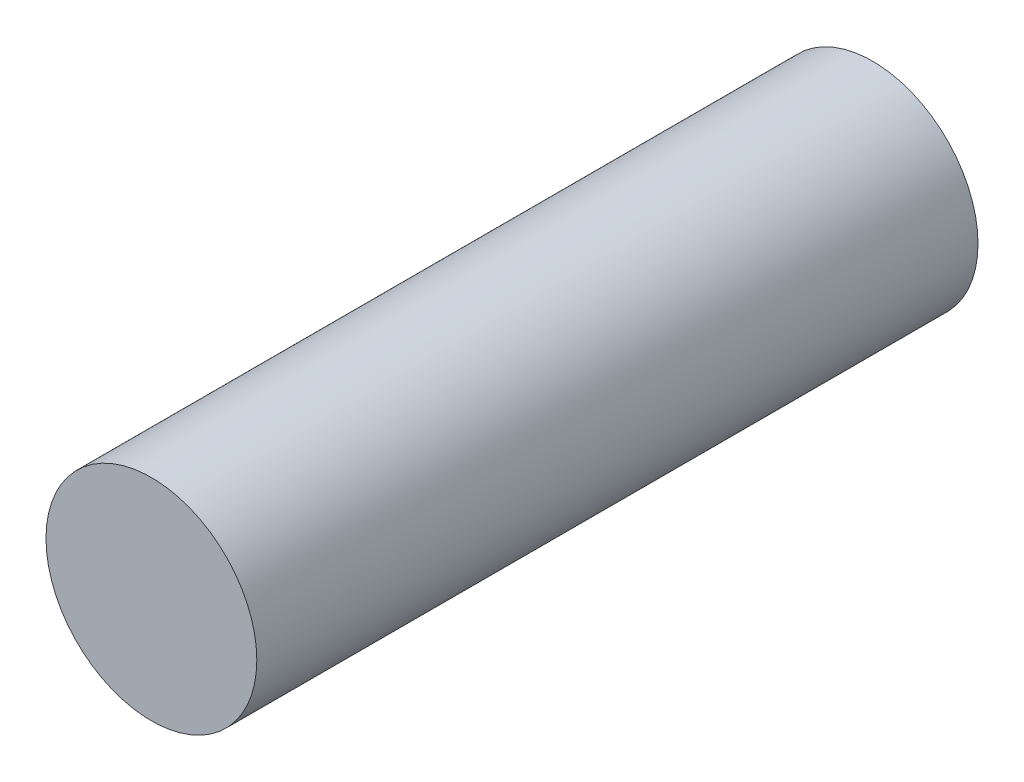
ISO-10303-21;
HEADER;
FILE_DESCRIPTION(('STEP AP214'),'2;1');
FILE_NAME('part.step','',(''),(''),'','','');
FILE_SCHEMA(('AUTOMOTIVE_DESIGN { 1 0 10303 214 1 1 1 1 }'));
ENDSEC;
DATA;
#1=APPLICATION_CONTEXT('core data for automotive mechanical design processes');
#2=APPLICATION_PROTOCOL_DEFINITION('international standard','automotive_design',2000,#1);
#3=PRODUCT_CONTEXT('',#1,'mechanical');
#4=PRODUCT('Part','Part','',(#3));
#5=PRODUCT_RELATED_PRODUCT_CATEGORY('part','',(#4));
#6=PRODUCT_DEFINITION_FORMATION('','',#4);
#7=PRODUCT_DEFINITION_CONTEXT('part definition',#1,'design');
#8=PRODUCT_DEFINITION('design','',#6,#7);
#9=PRODUCT_DEFINITION_SHAPE('','',#8);
#10=(LENGTH_UNIT() NAMED_UNIT(*) SI_UNIT(.MILLI.,.METRE.));
#11=(NAMED_UNIT(*) PLANE_ANGLE_UNIT() SI_UNIT($,.RADIAN.));
#12=(NAMED_UNIT(*) SI_UNIT($,.STERADIAN.) SOLID_ANGLE_UNIT());
#13=UNCERTAINTY_MEASURE_WITH_UNIT(LENGTH_MEASURE(1.E-05),#10,'distance_accuracy_value','');
#14=(GEOMETRIC_REPRESENTATION_CONTEXT(3) GLOBAL_UNCERTAINTY_ASSIGNED_CONTEXT((#13)) GLOBAL_UNIT_ASSIGNED_CONTEXT((#10,
#11,#12)) REPRESENTATION_CONTEXT('',''));
#15=CARTESIAN_POINT('',(0.,0.,0.));
#16=DIRECTION('',(0.,0.,1.));
#17=DIRECTION('',(1.,0.,0.));
#18=AXIS2_PLACEMENT_3D('',#15,#16,#17);
#19=CARTESIAN_POINT('',(0.,0.,65.));
#20=DIRECTION('',(0.,0.,-1.));
#21=DIRECTION('',(-1.,0.,0.));
#22=AXIS2_PLACEMENT_3D('',#19,#20,#21);
#23=CYLINDRICAL_SURFACE('',#22,9.5);
#24=CARTESIAN_POINT('',(0.,0.,65.));
#25=DIRECTION('',(0.,0.,1.));
#26=DIRECTION('',(1.,0.,0.));
#27=AXIS2_PLACEMENT_3D('',#24,#25,#26);
#28=CIRCLE('',#27,9.5);
#29=CARTESIAN_POINT('',(9.5,0.,65.));
#30=VERTEX_POINT('',#29);
#31=EDGE_CURVE('E10',#30,#30,#28,.T.);
#32=ORIENTED_EDGE('',*,*,#31,.F.);
#33=EDGE_LOOP('',(#32));
#34=FACE_BOUND('',#33,.T.);
#35=CARTESIAN_POINT('',(0.,0.,0.));
#36=DIRECTION('',(0.,0.,1.));
#37=DIRECTION('',(1.,0.,0.));
#38=AXIS2_PLACEMENT_3D('',#35,#36,#37);
#39=CIRCLE('',#38,9.5);
#40=CARTESIAN_POINT('',(9.5,0.,0.));
#41=VERTEX_POINT('',#40);
#42=EDGE_CURVE('E34',#41,#41,#39,.T.);
#43=ORIENTED_EDGE('',*,*,#42,.T.);
#44=EDGE_LOOP('',(#43));
#45=FACE_BOUND('',#44,.T.);
#46=ADVANCED_FACE('F31',(#34,#45),#23,.T.);
#47=CARTESIAN_POINT('',(0.,0.,65.));
#48=DIRECTION('',(0.,0.,1.));
#49=DIRECTION('',(1.,0.,0.));
#50=AXIS2_PLACEMENT_3D('',#47,#48,#49);
#51=PLANE('',#50);
#52=ORIENTED_EDGE('',*,*,#31,.T.);
#53=EDGE_LOOP('',(#52));
#54=FACE_BOUND('',#53,.T.);
#55=ADVANCED_FACE('F46',(#54),#51,.T.);
#56=CARTESIAN_POINT('',(0.,0.,0.));
#57=DIRECTION('',(0.,0.,1.));
#58=DIRECTION('',(1.,0.,0.));
#59=AXIS2_PLACEMENT_3D('',#56,#57,#58);
#60=PLANE('',#59);
#61=ORIENTED_EDGE('',*,*,#42,.F.);
#62=EDGE_LOOP('',(#61));
#63=FACE_BOUND('',#62,.T.);
#64=ADVANCED_FACE('F44',(#63),#60,.F.);
#65=CLOSED_SHELL('',(#46,#55,#64));
#66=MANIFOLD_SOLID_BREP('B2',#65);
#67=ADVANCED_BREP_SHAPE_REPRESENTATION('',(#18,#66),#14);
#68=SHAPE_DEFINITION_REPRESENTATION(#9,#67);
ENDSEC;
END-ISO-10303-21;
